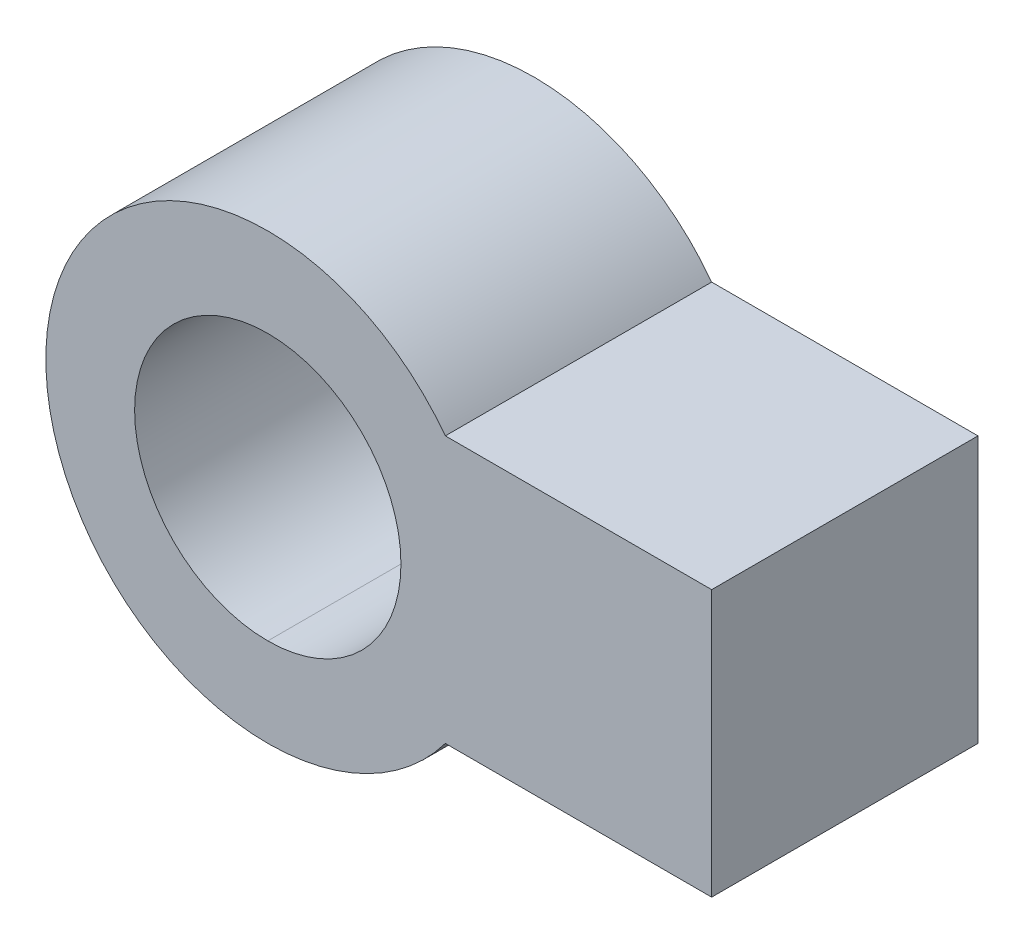
ISO-10303-21;
HEADER;
FILE_DESCRIPTION(('STEP AP214'),'2;1');
FILE_NAME('part.step','',(''),(''),'','','');
FILE_SCHEMA(('AUTOMOTIVE_DESIGN { 1 0 10303 214 1 1 1 1 }'));
ENDSEC;
DATA;
#1=APPLICATION_CONTEXT('core data for automotive mechanical design processes');
#2=APPLICATION_PROTOCOL_DEFINITION('international standard','automotive_design',2000,#1);
#3=PRODUCT_CONTEXT('',#1,'mechanical');
#4=PRODUCT('Part','Part','',(#3));
#5=PRODUCT_RELATED_PRODUCT_CATEGORY('part','',(#4));
#6=PRODUCT_DEFINITION_FORMATION('','',#4);
#7=PRODUCT_DEFINITION_CONTEXT('part definition',#1,'design');
#8=PRODUCT_DEFINITION('design','',#6,#7);
#9=PRODUCT_DEFINITION_SHAPE('','',#8);
#10=(LENGTH_UNIT() NAMED_UNIT(*) SI_UNIT(.MILLI.,.METRE.));
#11=(NAMED_UNIT(*) PLANE_ANGLE_UNIT() SI_UNIT($,.RADIAN.));
#12=(NAMED_UNIT(*) SI_UNIT($,.STERADIAN.) SOLID_ANGLE_UNIT());
#13=UNCERTAINTY_MEASURE_WITH_UNIT(LENGTH_MEASURE(1.E-05),#10,'distance_accuracy_value','');
#14=(GEOMETRIC_REPRESENTATION_CONTEXT(3) GLOBAL_UNCERTAINTY_ASSIGNED_CONTEXT((#13)) GLOBAL_UNIT_ASSIGNED_CONTEXT((#10,
#11,#12)) REPRESENTATION_CONTEXT('',''));
#15=CARTESIAN_POINT('',(0.,0.,0.));
#16=DIRECTION('',(0.,0.,1.));
#17=DIRECTION('',(1.,0.,0.));
#18=AXIS2_PLACEMENT_3D('',#15,#16,#17);
#19=CARTESIAN_POINT('',(0.,0.,6.));
#20=DIRECTION('',(0.,0.,1.));
#21=DIRECTION('',(1.,0.,0.));
#22=AXIS2_PLACEMENT_3D('',#19,#20,#21);
#23=PLANE('',#22);
#24=CARTESIAN_POINT('',(0.,0.,6.));
#25=DIRECTION('',(0.,0.,1.));
#26=DIRECTION('',(1.,0.,0.));
#27=AXIS2_PLACEMENT_3D('',#24,#25,#26);
#28=CIRCLE('',#27,5.);
#29=CARTESIAN_POINT('',(4.,3.,6.));
#30=VERTEX_POINT('',#29);
#31=CARTESIAN_POINT('',(4.,-3.,6.));
#32=VERTEX_POINT('',#31);
#33=EDGE_CURVE('E143',#30,#32,#28,.T.);
#34=ORIENTED_EDGE('',*,*,#33,.T.);
#35=DIRECTION('',(1.,0.,0.));
#36=VECTOR('',#35,1.);
#37=CARTESIAN_POINT('',(0.,-3.,6.));
#38=LINE('',#37,#36);
#39=CARTESIAN_POINT('',(10.,-3.,6.));
#40=VERTEX_POINT('',#39);
#41=EDGE_CURVE('E101',#32,#40,#38,.T.);
#42=ORIENTED_EDGE('',*,*,#41,.T.);
#43=DIRECTION('',(0.,1.,0.));
#44=VECTOR('',#43,1.);
#45=CARTESIAN_POINT('',(10.,0.,6.));
#46=LINE('',#45,#44);
#47=CARTESIAN_POINT('',(10.,3.,6.));
#48=VERTEX_POINT('',#47);
#49=EDGE_CURVE('E130',#40,#48,#46,.T.);
#50=ORIENTED_EDGE('',*,*,#49,.T.);
#51=DIRECTION('',(1.,0.,0.));
#52=VECTOR('',#51,1.);
#53=CARTESIAN_POINT('',(0.,3.,6.));
#54=LINE('',#53,#52);
#55=EDGE_CURVE('E126',#30,#48,#54,.T.);
#56=ORIENTED_EDGE('',*,*,#55,.F.);
#57=EDGE_LOOP('',(#34,#42,#50,#56));
#58=FACE_BOUND('',#57,.T.);
#59=CARTESIAN_POINT('',(0.,0.,6.));
#60=DIRECTION('',(0.,0.,1.));
#61=DIRECTION('',(1.,0.,0.));
#62=AXIS2_PLACEMENT_3D('',#59,#60,#61);
#63=CIRCLE('',#62,3.);
#64=CARTESIAN_POINT('',(0.,3.,6.));
#65=VERTEX_POINT('',#64);
#66=CARTESIAN_POINT('',(0.,-3.,6.));
#67=VERTEX_POINT('',#66);
#68=EDGE_CURVE('E121',#65,#67,#63,.T.);
#69=ORIENTED_EDGE('',*,*,#68,.F.);
#70=CARTESIAN_POINT('',(0.,0.,6.));
#71=DIRECTION('',(0.,0.,1.));
#72=DIRECTION('',(1.,0.,0.));
#73=AXIS2_PLACEMENT_3D('',#70,#71,#72);
#74=CIRCLE('',#73,3.);
#75=EDGE_CURVE('E110',#67,#65,#74,.T.);
#76=ORIENTED_EDGE('',*,*,#75,.F.);
#77=EDGE_LOOP('',(#69,#76));
#78=FACE_BOUND('',#77,.T.);
#79=ADVANCED_FACE('F51',(#58,#78),#23,.T.);
#80=CARTESIAN_POINT('',(0.,0.,0.));
#81=DIRECTION('',(0.,0.,1.));
#82=DIRECTION('',(1.,0.,0.));
#83=AXIS2_PLACEMENT_3D('',#80,#81,#82);
#84=PLANE('',#83);
#85=CARTESIAN_POINT('',(0.,0.,0.));
#86=DIRECTION('',(0.,0.,1.));
#87=DIRECTION('',(1.,0.,0.));
#88=AXIS2_PLACEMENT_3D('',#85,#86,#87);
#89=CIRCLE('',#88,5.);
#90=CARTESIAN_POINT('',(4.,3.,0.));
#91=VERTEX_POINT('',#90);
#92=CARTESIAN_POINT('',(4.,-3.,0.));
#93=VERTEX_POINT('',#92);
#94=EDGE_CURVE('E116',#91,#93,#89,.T.);
#95=ORIENTED_EDGE('',*,*,#94,.F.);
#96=DIRECTION('',(1.,0.,0.));
#97=VECTOR('',#96,1.);
#98=CARTESIAN_POINT('',(0.,3.,0.));
#99=LINE('',#98,#97);
#100=CARTESIAN_POINT('',(10.,3.,0.));
#101=VERTEX_POINT('',#100);
#102=EDGE_CURVE('E140',#91,#101,#99,.T.);
#103=ORIENTED_EDGE('',*,*,#102,.T.);
#104=DIRECTION('',(0.,1.,0.));
#105=VECTOR('',#104,1.);
#106=CARTESIAN_POINT('',(10.,0.,0.));
#107=LINE('',#106,#105);
#108=CARTESIAN_POINT('',(10.,-3.,0.));
#109=VERTEX_POINT('',#108);
#110=EDGE_CURVE('E137',#109,#101,#107,.T.);
#111=ORIENTED_EDGE('',*,*,#110,.F.);
#112=DIRECTION('',(1.,0.,0.));
#113=VECTOR('',#112,1.);
#114=CARTESIAN_POINT('',(0.,-3.,0.));
#115=LINE('',#114,#113);
#116=EDGE_CURVE('E135',#93,#109,#115,.T.);
#117=ORIENTED_EDGE('',*,*,#116,.F.);
#118=EDGE_LOOP('',(#95,#103,#111,#117));
#119=FACE_BOUND('',#118,.T.);
#120=CARTESIAN_POINT('',(0.,0.,0.));
#121=DIRECTION('',(0.,0.,1.));
#122=DIRECTION('',(1.,0.,0.));
#123=AXIS2_PLACEMENT_3D('',#120,#121,#122);
#124=CIRCLE('',#123,3.);
#125=CARTESIAN_POINT('',(0.,3.,0.));
#126=VERTEX_POINT('',#125);
#127=CARTESIAN_POINT('',(0.,-3.,0.));
#128=VERTEX_POINT('',#127);
#129=EDGE_CURVE('E12',#126,#128,#124,.F.);
#130=ORIENTED_EDGE('',*,*,#129,.F.);
#131=CARTESIAN_POINT('',(0.,0.,0.));
#132=DIRECTION('',(0.,0.,1.));
#133=DIRECTION('',(1.,0.,0.));
#134=AXIS2_PLACEMENT_3D('',#131,#132,#133);
#135=CIRCLE('',#134,3.);
#136=EDGE_CURVE('E123',#126,#128,#135,.T.);
#137=ORIENTED_EDGE('',*,*,#136,.T.);
#138=EDGE_LOOP('',(#130,#137));
#139=FACE_BOUND('',#138,.T.);
#140=ADVANCED_FACE('F152',(#119,#139),#84,.F.);
#141=CARTESIAN_POINT('',(0.,0.,6.));
#142=DIRECTION('',(0.,0.,-1.));
#143=DIRECTION('',(-1.,0.,0.));
#144=AXIS2_PLACEMENT_3D('',#141,#142,#143);
#145=CYLINDRICAL_SURFACE('',#144,5.);
#146=ORIENTED_EDGE('',*,*,#94,.T.);
#147=DIRECTION('',(0.,0.,-1.));
#148=VECTOR('',#147,1.);
#149=CARTESIAN_POINT('',(4.,-3.,6.));
#150=LINE('',#149,#148);
#151=EDGE_CURVE('E124',#32,#93,#150,.T.);
#152=ORIENTED_EDGE('',*,*,#151,.F.);
#153=ORIENTED_EDGE('',*,*,#33,.F.);
#154=DIRECTION('',(0.,0.,-1.));
#155=VECTOR('',#154,1.);
#156=CARTESIAN_POINT('',(4.,3.,6.));
#157=LINE('',#156,#155);
#158=EDGE_CURVE('E68',#30,#91,#157,.T.);
#159=ORIENTED_EDGE('',*,*,#158,.T.);
#160=EDGE_LOOP('',(#146,#152,#153,#159));
#161=FACE_BOUND('',#160,.T.);
#162=ADVANCED_FACE('F53',(#161),#145,.T.);
#163=CARTESIAN_POINT('',(0.,-3.,6.));
#164=DIRECTION('',(0.,1.,0.));
#165=DIRECTION('',(0.,0.,1.));
#166=AXIS2_PLACEMENT_3D('',#163,#164,#165);
#167=PLANE('',#166);
#168=ORIENTED_EDGE('',*,*,#116,.T.);
#169=DIRECTION('',(0.,0.,-1.));
#170=VECTOR('',#169,1.);
#171=CARTESIAN_POINT('',(10.,-3.,6.));
#172=LINE('',#171,#170);
#173=EDGE_CURVE('E147',#40,#109,#172,.T.);
#174=ORIENTED_EDGE('',*,*,#173,.F.);
#175=ORIENTED_EDGE('',*,*,#41,.F.);
#176=ORIENTED_EDGE('',*,*,#151,.T.);
#177=EDGE_LOOP('',(#168,#174,#175,#176));
#178=FACE_BOUND('',#177,.T.);
#179=ADVANCED_FACE('F150',(#178),#167,.F.);
#180=CARTESIAN_POINT('',(10.,0.,6.));
#181=DIRECTION('',(-1.,0.,0.));
#182=DIRECTION('',(0.,0.,1.));
#183=AXIS2_PLACEMENT_3D('',#180,#181,#182);
#184=PLANE('',#183);
#185=ORIENTED_EDGE('',*,*,#110,.T.);
#186=DIRECTION('',(0.,0.,-1.));
#187=VECTOR('',#186,1.);
#188=CARTESIAN_POINT('',(10.,3.,6.));
#189=LINE('',#188,#187);
#190=EDGE_CURVE('E128',#48,#101,#189,.T.);
#191=ORIENTED_EDGE('',*,*,#190,.F.);
#192=ORIENTED_EDGE('',*,*,#49,.F.);
#193=ORIENTED_EDGE('',*,*,#173,.T.);
#194=EDGE_LOOP('',(#185,#191,#192,#193));
#195=FACE_BOUND('',#194,.T.);
#196=ADVANCED_FACE('F160',(#195),#184,.F.);
#197=CARTESIAN_POINT('',(0.,3.,6.));
#198=DIRECTION('',(0.,1.,0.));
#199=DIRECTION('',(0.,0.,1.));
#200=AXIS2_PLACEMENT_3D('',#197,#198,#199);
#201=PLANE('',#200);
#202=ORIENTED_EDGE('',*,*,#102,.F.);
#203=ORIENTED_EDGE('',*,*,#158,.F.);
#204=ORIENTED_EDGE('',*,*,#55,.T.);
#205=ORIENTED_EDGE('',*,*,#190,.T.);
#206=EDGE_LOOP('',(#202,#203,#204,#205));
#207=FACE_BOUND('',#206,.T.);
#208=ADVANCED_FACE('F155',(#207),#201,.T.);
#209=CARTESIAN_POINT('',(0.,0.,6.));
#210=DIRECTION('',(0.,0.,-1.));
#211=DIRECTION('',(-1.,0.,0.));
#212=AXIS2_PLACEMENT_3D('',#209,#210,#211);
#213=CYLINDRICAL_SURFACE('',#212,3.);
#214=ORIENTED_EDGE('',*,*,#136,.F.);
#215=DIRECTION('',(0.,0.,-1.));
#216=VECTOR('',#215,1.);
#217=CARTESIAN_POINT('',(0.,3.,6.));
#218=LINE('',#217,#216);
#219=EDGE_CURVE('E93',#65,#126,#218,.T.);
#220=ORIENTED_EDGE('',*,*,#219,.F.);
#221=ORIENTED_EDGE('',*,*,#68,.T.);
#222=DIRECTION('',(0.,0.,-1.));
#223=VECTOR('',#222,1.);
#224=CARTESIAN_POINT('',(0.,-3.,6.));
#225=LINE('',#224,#223);
#226=EDGE_CURVE('E60',#67,#128,#225,.T.);
#227=ORIENTED_EDGE('',*,*,#226,.T.);
#228=EDGE_LOOP('',(#214,#220,#221,#227));
#229=FACE_BOUND('',#228,.T.);
#230=ADVANCED_FACE('F120',(#229),#213,.F.);
#231=CARTESIAN_POINT('',(0.,0.,6.));
#232=DIRECTION('',(0.,0.,-1.));
#233=DIRECTION('',(-1.,0.,0.));
#234=AXIS2_PLACEMENT_3D('',#231,#232,#233);
#235=CYLINDRICAL_SURFACE('',#234,3.);
#236=ORIENTED_EDGE('',*,*,#129,.T.);
#237=ORIENTED_EDGE('',*,*,#226,.F.);
#238=ORIENTED_EDGE('',*,*,#75,.T.);
#239=ORIENTED_EDGE('',*,*,#219,.T.);
#240=EDGE_LOOP('',(#236,#237,#238,#239));
#241=FACE_BOUND('',#240,.T.);
#242=ADVANCED_FACE('F111',(#241),#235,.F.);
#243=CLOSED_SHELL('',(#79,#140,#162,#179,#196,#208,#230,#242));
#244=MANIFOLD_SOLID_BREP('B2',#243);
#245=ADVANCED_BREP_SHAPE_REPRESENTATION('',(#18,#244),#14);
#246=SHAPE_DEFINITION_REPRESENTATION(#9,#245);
ENDSEC;
END-ISO-10303-21;
